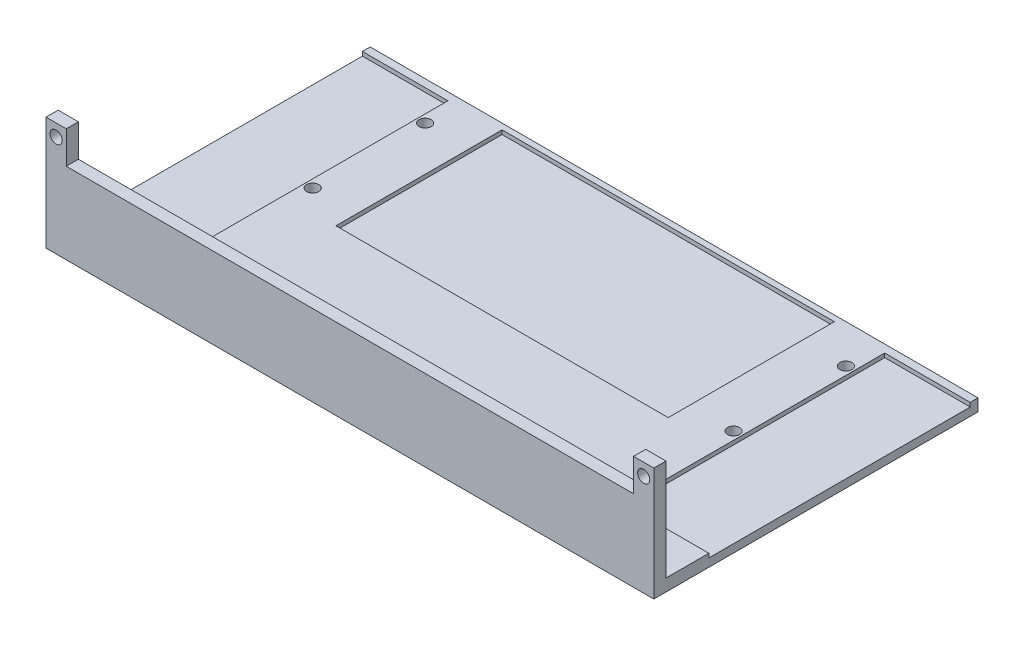
ISO-10303-21;
HEADER;
FILE_DESCRIPTION(('STEP AP214'),'2;1');
FILE_NAME('part.step','',(''),(''),'','','');
FILE_SCHEMA(('AUTOMOTIVE_DESIGN { 1 0 10303 214 1 1 1 1 }'));
ENDSEC;
DATA;
#1=APPLICATION_CONTEXT('core data for automotive mechanical design processes');
#2=APPLICATION_PROTOCOL_DEFINITION('international standard','automotive_design',2000,#1);
#3=PRODUCT_CONTEXT('',#1,'mechanical');
#4=PRODUCT('Part','Part','',(#3));
#5=PRODUCT_RELATED_PRODUCT_CATEGORY('part','',(#4));
#6=PRODUCT_DEFINITION_FORMATION('','',#4);
#7=PRODUCT_DEFINITION_CONTEXT('part definition',#1,'design');
#8=PRODUCT_DEFINITION('design','',#6,#7);
#9=PRODUCT_DEFINITION_SHAPE('','',#8);
#10=(LENGTH_UNIT() NAMED_UNIT(*) SI_UNIT(.MILLI.,.METRE.));
#11=(NAMED_UNIT(*) PLANE_ANGLE_UNIT() SI_UNIT($,.RADIAN.));
#12=(NAMED_UNIT(*) SI_UNIT($,.STERADIAN.) SOLID_ANGLE_UNIT());
#13=UNCERTAINTY_MEASURE_WITH_UNIT(LENGTH_MEASURE(1.E-05),#10,'distance_accuracy_value','');
#14=(GEOMETRIC_REPRESENTATION_CONTEXT(3) GLOBAL_UNCERTAINTY_ASSIGNED_CONTEXT((#13)) GLOBAL_UNIT_ASSIGNED_CONTEXT((#10,
#11,#12)) REPRESENTATION_CONTEXT('',''));
#15=CARTESIAN_POINT('',(0.,0.,0.));
#16=DIRECTION('',(0.,0.,1.));
#17=DIRECTION('',(1.,0.,0.));
#18=AXIS2_PLACEMENT_3D('',#15,#16,#17);
#19=CARTESIAN_POINT('',(-150.,28.,62.755935242314));
#20=DIRECTION('',(0.,-1.,0.));
#21=DIRECTION('',(0.,0.,-1.));
#22=AXIS2_PLACEMENT_3D('',#19,#20,#21);
#23=PLANE('',#22);
#24=DIRECTION('',(1.,0.,0.));
#25=VECTOR('',#24,1.);
#26=CARTESIAN_POINT('',(-150.,28.,59.755935242314));
#27=LINE('',#26,#25);
#28=CARTESIAN_POINT('',(-5.,28.,59.755935242314));
#29=VERTEX_POINT('',#28);
#30=CARTESIAN_POINT('',(0.,28.,59.755935242314));
#31=VERTEX_POINT('',#30);
#32=EDGE_CURVE('E205',#29,#31,#27,.T.);
#33=ORIENTED_EDGE('',*,*,#32,.F.);
#34=DIRECTION('',(0.,0.,1.));
#35=VECTOR('',#34,1.);
#36=CARTESIAN_POINT('',(-5.,28.,59.755935242314));
#37=LINE('',#36,#35);
#38=CARTESIAN_POINT('',(-5.,28.,62.755935242314));
#39=VERTEX_POINT('',#38);
#40=EDGE_CURVE('E190',#29,#39,#37,.T.);
#41=ORIENTED_EDGE('',*,*,#40,.T.);
#42=DIRECTION('',(1.,0.,0.));
#43=VECTOR('',#42,1.);
#44=CARTESIAN_POINT('',(-150.,28.,62.755935242314));
#45=LINE('',#44,#43);
#46=CARTESIAN_POINT('',(0.,28.,62.755935242314));
#47=VERTEX_POINT('',#46);
#48=EDGE_CURVE('E222',#39,#47,#45,.T.);
#49=ORIENTED_EDGE('',*,*,#48,.T.);
#50=DIRECTION('',(0.,0.,-1.));
#51=VECTOR('',#50,1.);
#52=CARTESIAN_POINT('',(0.,28.,62.755935242314));
#53=LINE('',#52,#51);
#54=EDGE_CURVE('E213',#47,#31,#53,.T.);
#55=ORIENTED_EDGE('',*,*,#54,.T.);
#56=EDGE_LOOP('',(#33,#41,#49,#55));
#57=FACE_BOUND('',#56,.T.);
#58=ADVANCED_FACE('F39',(#57),#23,.F.);
#59=CARTESIAN_POINT('',(-150.,0.,-17.244064757686));
#60=DIRECTION('',(0.,0.,-1.));
#61=DIRECTION('',(-1.,0.,0.));
#62=AXIS2_PLACEMENT_3D('',#59,#60,#61);
#63=PLANE('',#62);
#64=DIRECTION('',(0.,1.,0.));
#65=VECTOR('',#64,1.);
#66=CARTESIAN_POINT('',(0.,0.,-17.244064757686));
#67=LINE('',#66,#65);
#68=CARTESIAN_POINT('',(0.,0.,-17.244064757686));
#69=VERTEX_POINT('',#68);
#70=CARTESIAN_POINT('',(0.,3.00000000000001,-17.244064757686));
#71=VERTEX_POINT('',#70);
#72=EDGE_CURVE('E250',#69,#71,#67,.T.);
#73=ORIENTED_EDGE('',*,*,#72,.F.);
#74=DIRECTION('',(1.,0.,0.));
#75=VECTOR('',#74,1.);
#76=CARTESIAN_POINT('',(-150.,0.,-17.244064757686));
#77=LINE('',#76,#75);
#78=CARTESIAN_POINT('',(-150.,0.,-17.244064757686));
#79=VERTEX_POINT('',#78);
#80=EDGE_CURVE('E11',#79,#69,#77,.T.);
#81=ORIENTED_EDGE('',*,*,#80,.F.);
#82=DIRECTION('',(0.,1.,0.));
#83=VECTOR('',#82,1.);
#84=CARTESIAN_POINT('',(-150.,0.,-17.244064757686));
#85=LINE('',#84,#83);
#86=CARTESIAN_POINT('',(-150.,3.00000000000001,-17.244064757686));
#87=VERTEX_POINT('',#86);
#88=EDGE_CURVE('E235',#79,#87,#85,.T.);
#89=ORIENTED_EDGE('',*,*,#88,.T.);
#90=DIRECTION('',(1.,0.,0.));
#91=VECTOR('',#90,1.);
#92=CARTESIAN_POINT('',(-150.,3.00000000000001,-17.244064757686));
#93=LINE('',#92,#91);
#94=EDGE_CURVE('E43',#87,#71,#93,.T.);
#95=ORIENTED_EDGE('',*,*,#94,.T.);
#96=EDGE_LOOP('',(#73,#81,#89,#95));
#97=FACE_BOUND('',#96,.T.);
#98=ADVANCED_FACE('F41',(#97),#63,.T.);
#99=CARTESIAN_POINT('',(-150.,0.,62.755935242314));
#100=DIRECTION('',(0.,-1.,0.));
#101=DIRECTION('',(0.,0.,-1.));
#102=AXIS2_PLACEMENT_3D('',#99,#100,#101);
#103=PLANE('',#102);
#104=CARTESIAN_POINT('',(-23.1,0.,20.005935242314));
#105=DIRECTION('',(0.,1.,0.));
#106=DIRECTION('',(0.,0.,1.));
#107=AXIS2_PLACEMENT_3D('',#104,#105,#106);
#108=CIRCLE('',#107,1.5);
#109=CARTESIAN_POINT('',(-23.1,0.,21.505935242314));
#110=VERTEX_POINT('',#109);
#111=EDGE_CURVE('E438',#110,#110,#108,.T.);
#112=ORIENTED_EDGE('',*,*,#111,.T.);
#113=EDGE_LOOP('',(#112));
#114=FACE_BOUND('',#113,.T.);
#115=CARTESIAN_POINT('',(-23.1,0.,-7.74406475768604));
#116=DIRECTION('',(0.,1.,0.));
#117=DIRECTION('',(0.,0.,1.));
#118=AXIS2_PLACEMENT_3D('',#115,#116,#117);
#119=CIRCLE('',#118,1.5);
#120=CARTESIAN_POINT('',(-23.1,0.,-6.24406475768604));
#121=VERTEX_POINT('',#120);
#122=EDGE_CURVE('E463',#121,#121,#119,.T.);
#123=ORIENTED_EDGE('',*,*,#122,.T.);
#124=EDGE_LOOP('',(#123));
#125=FACE_BOUND('',#124,.T.);
#126=CARTESIAN_POINT('',(-126.934112686196,0.,47.755935242314));
#127=DIRECTION('',(0.,1.,0.));
#128=DIRECTION('',(0.,0.,1.));
#129=AXIS2_PLACEMENT_3D('',#126,#127,#128);
#130=CIRCLE('',#129,1.5);
#131=CARTESIAN_POINT('',(-126.934112686196,0.,49.255935242314));
#132=VERTEX_POINT('',#131);
#133=EDGE_CURVE('E455',#132,#132,#130,.T.);
#134=ORIENTED_EDGE('',*,*,#133,.T.);
#135=EDGE_LOOP('',(#134));
#136=FACE_BOUND('',#135,.T.);
#137=CARTESIAN_POINT('',(-126.934112686196,0.,20.005935242314));
#138=DIRECTION('',(0.,1.,0.));
#139=DIRECTION('',(0.,0.,1.));
#140=AXIS2_PLACEMENT_3D('',#137,#138,#139);
#141=CIRCLE('',#140,1.5);
#142=CARTESIAN_POINT('',(-126.934112686196,0.,21.505935242314));
#143=VERTEX_POINT('',#142);
#144=EDGE_CURVE('E446',#143,#143,#141,.T.);
#145=ORIENTED_EDGE('',*,*,#144,.T.);
#146=EDGE_LOOP('',(#145));
#147=FACE_BOUND('',#146,.T.);
#148=CARTESIAN_POINT('',(-126.934112686196,0.,-7.74406475768604));
#149=DIRECTION('',(0.,1.,0.));
#150=DIRECTION('',(0.,0.,1.));
#151=AXIS2_PLACEMENT_3D('',#148,#149,#150);
#152=CIRCLE('',#151,1.5);
#153=CARTESIAN_POINT('',(-126.934112686196,0.,-6.24406475768604));
#154=VERTEX_POINT('',#153);
#155=EDGE_CURVE('E447',#154,#154,#152,.T.);
#156=ORIENTED_EDGE('',*,*,#155,.T.);
#157=EDGE_LOOP('',(#156));
#158=FACE_BOUND('',#157,.T.);
#159=CARTESIAN_POINT('',(-23.1,0.,47.755935242314));
#160=DIRECTION('',(0.,1.,0.));
#161=DIRECTION('',(0.,0.,1.));
#162=AXIS2_PLACEMENT_3D('',#159,#160,#161);
#163=CIRCLE('',#162,1.5);
#164=CARTESIAN_POINT('',(-23.1,0.,49.255935242314));
#165=VERTEX_POINT('',#164);
#166=EDGE_CURVE('E423',#165,#165,#163,.T.);
#167=ORIENTED_EDGE('',*,*,#166,.T.);
#168=EDGE_LOOP('',(#167));
#169=FACE_BOUND('',#168,.T.);
#170=DIRECTION('',(0.,0.,-1.));
#171=VECTOR('',#170,1.);
#172=CARTESIAN_POINT('',(0.,0.,62.755935242314));
#173=LINE('',#172,#171);
#174=CARTESIAN_POINT('',(0.,0.,62.755935242314));
#175=VERTEX_POINT('',#174);
#176=EDGE_CURVE('E231',#175,#69,#173,.T.);
#177=ORIENTED_EDGE('',*,*,#176,.F.);
#178=DIRECTION('',(1.,0.,0.));
#179=VECTOR('',#178,1.);
#180=CARTESIAN_POINT('',(-150.,0.,62.755935242314));
#181=LINE('',#180,#179);
#182=CARTESIAN_POINT('',(-150.,0.,62.755935242314));
#183=VERTEX_POINT('',#182);
#184=EDGE_CURVE('E49',#183,#175,#181,.T.);
#185=ORIENTED_EDGE('',*,*,#184,.F.);
#186=DIRECTION('',(0.,0.,-1.));
#187=VECTOR('',#186,1.);
#188=CARTESIAN_POINT('',(-150.,0.,62.755935242314));
#189=LINE('',#188,#187);
#190=EDGE_CURVE('E255',#183,#79,#189,.T.);
#191=ORIENTED_EDGE('',*,*,#190,.T.);
#192=ORIENTED_EDGE('',*,*,#80,.T.);
#193=EDGE_LOOP('',(#177,#185,#191,#192));
#194=FACE_BOUND('',#193,.T.);
#195=ADVANCED_FACE('F482',(#114,#125,#136,#147,#158,#169,#194),#103,.T.);
#196=CARTESIAN_POINT('',(-150.,0.,62.755935242314));
#197=DIRECTION('',(0.,0.,-1.));
#198=DIRECTION('',(-1.,0.,0.));
#199=AXIS2_PLACEMENT_3D('',#196,#197,#198);
#200=PLANE('',#199);
#201=CARTESIAN_POINT('',(-2.5,25.,62.755935242314));
#202=DIRECTION('',(0.,0.,1.));
#203=DIRECTION('',(1.,0.,0.));
#204=AXIS2_PLACEMENT_3D('',#201,#202,#203);
#205=CIRCLE('',#204,1.5);
#206=CARTESIAN_POINT('',(-1.,25.,62.755935242314));
#207=VERTEX_POINT('',#206);
#208=EDGE_CURVE('E427',#207,#207,#205,.T.);
#209=ORIENTED_EDGE('',*,*,#208,.F.);
#210=EDGE_LOOP('',(#209));
#211=FACE_BOUND('',#210,.T.);
#212=CARTESIAN_POINT('',(-147.5,25.,62.755935242314));
#213=DIRECTION('',(0.,0.,1.));
#214=DIRECTION('',(1.,0.,0.));
#215=AXIS2_PLACEMENT_3D('',#212,#213,#214);
#216=CIRCLE('',#215,1.5);
#217=CARTESIAN_POINT('',(-146.,25.,62.755935242314));
#218=VERTEX_POINT('',#217);
#219=EDGE_CURVE('E418',#218,#218,#216,.T.);
#220=ORIENTED_EDGE('',*,*,#219,.F.);
#221=EDGE_LOOP('',(#220));
#222=FACE_BOUND('',#221,.T.);
#223=ORIENTED_EDGE('',*,*,#48,.F.);
#224=DIRECTION('',(0.,1.,0.));
#225=VECTOR('',#224,1.);
#226=CARTESIAN_POINT('',(-5.,20.,62.755935242314));
#227=LINE('',#226,#225);
#228=CARTESIAN_POINT('',(-5.,20.,62.755935242314));
#229=VERTEX_POINT('',#228);
#230=EDGE_CURVE('E195',#229,#39,#227,.T.);
#231=ORIENTED_EDGE('',*,*,#230,.F.);
#232=DIRECTION('',(1.,0.,0.));
#233=VECTOR('',#232,1.);
#234=CARTESIAN_POINT('',(-145.,20.,62.755935242314));
#235=LINE('',#234,#233);
#236=CARTESIAN_POINT('',(-145.,20.,62.755935242314));
#237=VERTEX_POINT('',#236);
#238=EDGE_CURVE('E210',#237,#229,#235,.T.);
#239=ORIENTED_EDGE('',*,*,#238,.F.);
#240=DIRECTION('',(0.,-1.,0.));
#241=VECTOR('',#240,1.);
#242=CARTESIAN_POINT('',(-145.,28.,62.755935242314));
#243=LINE('',#242,#241);
#244=CARTESIAN_POINT('',(-145.,28.,62.755935242314));
#245=VERTEX_POINT('',#244);
#246=EDGE_CURVE('E407',#245,#237,#243,.T.);
#247=ORIENTED_EDGE('',*,*,#246,.F.);
#248=CARTESIAN_POINT('',(-150.,28.,62.755935242314));
#249=VERTEX_POINT('',#248);
#250=EDGE_CURVE('E225',#249,#245,#45,.T.);
#251=ORIENTED_EDGE('',*,*,#250,.F.);
#252=DIRECTION('',(0.,1.,0.));
#253=VECTOR('',#252,1.);
#254=CARTESIAN_POINT('',(-150.,0.,62.755935242314));
#255=LINE('',#254,#253);
#256=EDGE_CURVE('E259',#183,#249,#255,.T.);
#257=ORIENTED_EDGE('',*,*,#256,.F.);
#258=ORIENTED_EDGE('',*,*,#184,.T.);
#259=DIRECTION('',(0.,1.,0.));
#260=VECTOR('',#259,1.);
#261=CARTESIAN_POINT('',(0.,0.,62.755935242314));
#262=LINE('',#261,#260);
#263=EDGE_CURVE('E236',#175,#47,#262,.T.);
#264=ORIENTED_EDGE('',*,*,#263,.T.);
#265=EDGE_LOOP('',(#223,#231,#239,#247,#251,#257,#258,#264));
#266=FACE_BOUND('',#265,.T.);
#267=ADVANCED_FACE('F544',(#211,#222,#266),#200,.F.);
#268=ORIENTED_EDGE('',*,*,#250,.T.);
#269=DIRECTION('',(0.,0.,1.));
#270=VECTOR('',#269,1.);
#271=CARTESIAN_POINT('',(-145.,28.,59.755935242314));
#272=LINE('',#271,#270);
#273=CARTESIAN_POINT('',(-145.,28.,59.755935242314));
#274=VERTEX_POINT('',#273);
#275=EDGE_CURVE('E200',#274,#245,#272,.T.);
#276=ORIENTED_EDGE('',*,*,#275,.F.);
#277=CARTESIAN_POINT('',(-150.,28.,59.755935242314));
#278=VERTEX_POINT('',#277);
#279=EDGE_CURVE('E216',#278,#274,#27,.T.);
#280=ORIENTED_EDGE('',*,*,#279,.F.);
#281=DIRECTION('',(0.,0.,-1.));
#282=VECTOR('',#281,1.);
#283=CARTESIAN_POINT('',(-150.,28.,62.755935242314));
#284=LINE('',#283,#282);
#285=EDGE_CURVE('E262',#249,#278,#284,.T.);
#286=ORIENTED_EDGE('',*,*,#285,.F.);
#287=EDGE_LOOP('',(#268,#276,#280,#286));
#288=FACE_BOUND('',#287,.T.);
#289=ADVANCED_FACE('F537',(#288),#23,.F.);
#290=CARTESIAN_POINT('',(-150.,28.,59.755935242314));
#291=DIRECTION('',(0.,0.,1.));
#292=DIRECTION('',(0.,-1.,0.));
#293=AXIS2_PLACEMENT_3D('',#290,#291,#292);
#294=PLANE('',#293);
#295=CARTESIAN_POINT('',(-2.5,25.,59.755935242314));
#296=DIRECTION('',(0.,0.,1.));
#297=DIRECTION('',(1.,0.,0.));
#298=AXIS2_PLACEMENT_3D('',#295,#296,#297);
#299=CIRCLE('',#298,1.5);
#300=CARTESIAN_POINT('',(-1.,25.,59.755935242314));
#301=VERTEX_POINT('',#300);
#302=EDGE_CURVE('E413',#301,#301,#299,.T.);
#303=ORIENTED_EDGE('',*,*,#302,.T.);
#304=EDGE_LOOP('',(#303));
#305=FACE_BOUND('',#304,.T.);
#306=CARTESIAN_POINT('',(-147.5,25.,59.755935242314));
#307=DIRECTION('',(0.,0.,1.));
#308=DIRECTION('',(1.,0.,0.));
#309=AXIS2_PLACEMENT_3D('',#306,#307,#308);
#310=CIRCLE('',#309,1.5);
#311=CARTESIAN_POINT('',(-146.,25.,59.755935242314));
#312=VERTEX_POINT('',#311);
#313=EDGE_CURVE('E422',#312,#312,#310,.T.);
#314=ORIENTED_EDGE('',*,*,#313,.T.);
#315=EDGE_LOOP('',(#314));
#316=FACE_BOUND('',#315,.T.);
#317=DIRECTION('',(1.,0.,0.));
#318=VECTOR('',#317,1.);
#319=CARTESIAN_POINT('',(-145.,20.,59.755935242314));
#320=LINE('',#319,#318);
#321=CARTESIAN_POINT('',(-145.,20.,59.755935242314));
#322=VERTEX_POINT('',#321);
#323=CARTESIAN_POINT('',(-5.,20.,59.755935242314));
#324=VERTEX_POINT('',#323);
#325=EDGE_CURVE('E57',#322,#324,#320,.T.);
#326=ORIENTED_EDGE('',*,*,#325,.T.);
#327=DIRECTION('',(0.,1.,0.));
#328=VECTOR('',#327,1.);
#329=CARTESIAN_POINT('',(-5.,20.,59.755935242314));
#330=LINE('',#329,#328);
#331=EDGE_CURVE('E193',#324,#29,#330,.T.);
#332=ORIENTED_EDGE('',*,*,#331,.T.);
#333=ORIENTED_EDGE('',*,*,#32,.T.);
#334=DIRECTION('',(0.,-1.,0.));
#335=VECTOR('',#334,1.);
#336=CARTESIAN_POINT('',(0.,28.,59.755935242314));
#337=LINE('',#336,#335);
#338=CARTESIAN_POINT('',(0.,3.,59.755935242314));
#339=VERTEX_POINT('',#338);
#340=EDGE_CURVE('E242',#31,#339,#337,.T.);
#341=ORIENTED_EDGE('',*,*,#340,.T.);
#342=DIRECTION('',(1.,0.,0.));
#343=VECTOR('',#342,1.);
#344=CARTESIAN_POINT('',(-150.,3.,59.755935242314));
#345=LINE('',#344,#343);
#346=CARTESIAN_POINT('',(-150.,3.,59.755935242314));
#347=VERTEX_POINT('',#346);
#348=EDGE_CURVE('E217',#347,#339,#345,.T.);
#349=ORIENTED_EDGE('',*,*,#348,.F.);
#350=DIRECTION('',(0.,-1.,0.));
#351=VECTOR('',#350,1.);
#352=CARTESIAN_POINT('',(-150.,28.,59.755935242314));
#353=LINE('',#352,#351);
#354=EDGE_CURVE('E265',#278,#347,#353,.T.);
#355=ORIENTED_EDGE('',*,*,#354,.F.);
#356=ORIENTED_EDGE('',*,*,#279,.T.);
#357=DIRECTION('',(0.,-1.,0.));
#358=VECTOR('',#357,1.);
#359=CARTESIAN_POINT('',(-145.,28.,59.755935242314));
#360=LINE('',#359,#358);
#361=EDGE_CURVE('E209',#274,#322,#360,.T.);
#362=ORIENTED_EDGE('',*,*,#361,.T.);
#363=EDGE_LOOP('',(#326,#332,#333,#341,#349,#355,#356,#362));
#364=FACE_BOUND('',#363,.T.);
#365=ADVANCED_FACE('F203',(#305,#316,#364),#294,.F.);
#366=CARTESIAN_POINT('',(-150.,3.00000000000001,-17.244064757686));
#367=DIRECTION('',(0.,1.,0.));
#368=DIRECTION('',(0.,0.,1.));
#369=AXIS2_PLACEMENT_3D('',#366,#367,#368);
#370=PLANE('',#369);
#371=CARTESIAN_POINT('',(-23.1,3.,20.005935242314));
#372=DIRECTION('',(0.,1.,0.));
#373=DIRECTION('',(0.,0.,1.));
#374=AXIS2_PLACEMENT_3D('',#371,#372,#373);
#375=CIRCLE('',#374,1.5);
#376=CARTESIAN_POINT('',(-23.1,3.,21.505935242314));
#377=VERTEX_POINT('',#376);
#378=EDGE_CURVE('E467',#377,#377,#375,.T.);
#379=ORIENTED_EDGE('',*,*,#378,.F.);
#380=EDGE_LOOP('',(#379));
#381=FACE_BOUND('',#380,.T.);
#382=CARTESIAN_POINT('',(-23.1,3.00000000000001,-7.74406475768604));
#383=DIRECTION('',(0.,1.,0.));
#384=DIRECTION('',(0.,0.,1.));
#385=AXIS2_PLACEMENT_3D('',#382,#383,#384);
#386=CIRCLE('',#385,1.5);
#387=CARTESIAN_POINT('',(-23.1,3.00000000000001,-6.24406475768604));
#388=VERTEX_POINT('',#387);
#389=EDGE_CURVE('E459',#388,#388,#386,.T.);
#390=ORIENTED_EDGE('',*,*,#389,.F.);
#391=EDGE_LOOP('',(#390));
#392=FACE_BOUND('',#391,.T.);
#393=CARTESIAN_POINT('',(-126.934112686196,3.,47.755935242314));
#394=DIRECTION('',(0.,1.,0.));
#395=DIRECTION('',(0.,0.,1.));
#396=AXIS2_PLACEMENT_3D('',#393,#394,#395);
#397=CIRCLE('',#396,1.5);
#398=CARTESIAN_POINT('',(-126.934112686196,3.,49.255935242314));
#399=VERTEX_POINT('',#398);
#400=EDGE_CURVE('E451',#399,#399,#397,.T.);
#401=ORIENTED_EDGE('',*,*,#400,.F.);
#402=EDGE_LOOP('',(#401));
#403=FACE_BOUND('',#402,.T.);
#404=CARTESIAN_POINT('',(-126.934112686196,3.,20.005935242314));
#405=DIRECTION('',(0.,1.,0.));
#406=DIRECTION('',(0.,0.,1.));
#407=AXIS2_PLACEMENT_3D('',#404,#405,#406);
#408=CIRCLE('',#407,1.5);
#409=CARTESIAN_POINT('',(-126.934112686196,3.,21.505935242314));
#410=VERTEX_POINT('',#409);
#411=EDGE_CURVE('E442',#410,#410,#408,.T.);
#412=ORIENTED_EDGE('',*,*,#411,.F.);
#413=EDGE_LOOP('',(#412));
#414=FACE_BOUND('',#413,.T.);
#415=CARTESIAN_POINT('',(-126.934112686196,3.00000000000001,-7.74406475768604));
#416=DIRECTION('',(0.,1.,0.));
#417=DIRECTION('',(0.,0.,1.));
#418=AXIS2_PLACEMENT_3D('',#415,#416,#417);
#419=CIRCLE('',#418,1.5);
#420=CARTESIAN_POINT('',(-126.934112686196,3.00000000000001,-6.24406475768604));
#421=VERTEX_POINT('',#420);
#422=EDGE_CURVE('E474',#421,#421,#419,.T.);
#423=ORIENTED_EDGE('',*,*,#422,.F.);
#424=EDGE_LOOP('',(#423));
#425=FACE_BOUND('',#424,.T.);
#426=CARTESIAN_POINT('',(-23.1,3.,47.755935242314));
#427=DIRECTION('',(0.,1.,0.));
#428=DIRECTION('',(0.,0.,1.));
#429=AXIS2_PLACEMENT_3D('',#426,#427,#428);
#430=CIRCLE('',#429,1.5);
#431=CARTESIAN_POINT('',(-23.1,3.,49.255935242314));
#432=VERTEX_POINT('',#431);
#433=EDGE_CURVE('E434',#432,#432,#430,.T.);
#434=ORIENTED_EDGE('',*,*,#433,.F.);
#435=EDGE_LOOP('',(#434));
#436=FACE_BOUND('',#435,.T.);
#437=DIRECTION('',(1.,0.,0.));
#438=VECTOR('',#437,1.);
#439=CARTESIAN_POINT('',(-34.,3.,25.205935242314));
#440=LINE('',#439,#438);
#441=CARTESIAN_POINT('',(-116.,3.,25.205935242314));
#442=VERTEX_POINT('',#441);
#443=CARTESIAN_POINT('',(-34.,3.,25.205935242314));
#444=VERTEX_POINT('',#443);
#445=EDGE_CURVE('E65',#442,#444,#440,.T.);
#446=ORIENTED_EDGE('',*,*,#445,.F.);
#447=DIRECTION('',(0.,0.,1.));
#448=VECTOR('',#447,1.);
#449=CARTESIAN_POINT('',(-116.,3.,25.205935242314));
#450=LINE('',#449,#448);
#451=CARTESIAN_POINT('',(-116.,3.00000000000001,-15.794064757686));
#452=VERTEX_POINT('',#451);
#453=EDGE_CURVE('E367',#452,#442,#450,.T.);
#454=ORIENTED_EDGE('',*,*,#453,.F.);
#455=DIRECTION('',(-1.,0.,0.));
#456=VECTOR('',#455,1.);
#457=CARTESIAN_POINT('',(-116.,3.00000000000001,-15.794064757686));
#458=LINE('',#457,#456);
#459=CARTESIAN_POINT('',(-34.,3.00000000000001,-15.794064757686));
#460=VERTEX_POINT('',#459);
#461=EDGE_CURVE('E372',#460,#452,#458,.T.);
#462=ORIENTED_EDGE('',*,*,#461,.F.);
#463=DIRECTION('',(0.,0.,-1.));
#464=VECTOR('',#463,1.);
#465=CARTESIAN_POINT('',(-34.,3.00000000000001,-15.794064757686));
#466=LINE('',#465,#464);
#467=EDGE_CURVE('E376',#444,#460,#466,.T.);
#468=ORIENTED_EDGE('',*,*,#467,.F.);
#469=EDGE_LOOP('',(#446,#454,#462,#468));
#470=FACE_BOUND('',#469,.T.);
#471=DIRECTION('',(-1.,0.,0.));
#472=VECTOR('',#471,1.);
#473=CARTESIAN_POINT('',(-128.9,3.00000000000001,-15.3229235967249));
#474=LINE('',#473,#472);
#475=CARTESIAN_POINT('',(-128.9,3.00000000000001,-15.3229235967249));
#476=VERTEX_POINT('',#475);
#477=CARTESIAN_POINT('',(-150.,3.00000000000001,-15.3229235967249));
#478=VERTEX_POINT('',#477);
#479=EDGE_CURVE('E291',#476,#478,#474,.T.);
#480=ORIENTED_EDGE('',*,*,#479,.F.);
#481=DIRECTION('',(0.,0.,-1.));
#482=VECTOR('',#481,1.);
#483=CARTESIAN_POINT('',(-128.9,3.,49.1770764032751));
#484=LINE('',#483,#482);
#485=CARTESIAN_POINT('',(-128.9,3.,49.1770764032751));
#486=VERTEX_POINT('',#485);
#487=EDGE_CURVE('E331',#486,#476,#484,.T.);
#488=ORIENTED_EDGE('',*,*,#487,.F.);
#489=DIRECTION('',(1.,0.,0.));
#490=VECTOR('',#489,1.);
#491=CARTESIAN_POINT('',(-150.,3.,49.1770764032751));
#492=LINE('',#491,#490);
#493=CARTESIAN_POINT('',(-150.,3.,49.1770764032751));
#494=VERTEX_POINT('',#493);
#495=EDGE_CURVE('E336',#494,#486,#492,.T.);
#496=ORIENTED_EDGE('',*,*,#495,.F.);
#497=DIRECTION('',(0.,0.,1.));
#498=VECTOR('',#497,1.);
#499=CARTESIAN_POINT('',(-150.,3.00000000000001,-17.244064757686));
#500=LINE('',#499,#498);
#501=EDGE_CURVE('E273',#494,#347,#500,.T.);
#502=ORIENTED_EDGE('',*,*,#501,.T.);
#503=ORIENTED_EDGE('',*,*,#348,.T.);
#504=DIRECTION('',(0.,0.,1.));
#505=VECTOR('',#504,1.);
#506=CARTESIAN_POINT('',(0.,3.00000000000001,-17.244064757686));
#507=LINE('',#506,#505);
#508=CARTESIAN_POINT('',(0.,3.,49.1770764032751));
#509=VERTEX_POINT('',#508);
#510=EDGE_CURVE('E249',#509,#339,#507,.T.);
#511=ORIENTED_EDGE('',*,*,#510,.F.);
#512=DIRECTION('',(1.,0.,0.));
#513=VECTOR('',#512,1.);
#514=CARTESIAN_POINT('',(-21.1,3.,49.1770764032751));
#515=LINE('',#514,#513);
#516=CARTESIAN_POINT('',(-21.1,3.,49.1770764032751));
#517=VERTEX_POINT('',#516);
#518=EDGE_CURVE('E292',#517,#509,#515,.T.);
#519=ORIENTED_EDGE('',*,*,#518,.F.);
#520=DIRECTION('',(0.,0.,1.));
#521=VECTOR('',#520,1.);
#522=CARTESIAN_POINT('',(-21.1,3.00000000000001,-15.3229235967249));
#523=LINE('',#522,#521);
#524=CARTESIAN_POINT('',(-21.1,3.00000000000001,-15.3229235967249));
#525=VERTEX_POINT('',#524);
#526=EDGE_CURVE('E296',#525,#517,#523,.T.);
#527=ORIENTED_EDGE('',*,*,#526,.F.);
#528=DIRECTION('',(-1.,0.,0.));
#529=VECTOR('',#528,1.);
#530=CARTESIAN_POINT('',(0.,3.00000000000001,-15.3229235967249));
#531=LINE('',#530,#529);
#532=CARTESIAN_POINT('',(0.,3.00000000000001,-15.3229235967249));
#533=VERTEX_POINT('',#532);
#534=EDGE_CURVE('E300',#533,#525,#531,.T.);
#535=ORIENTED_EDGE('',*,*,#534,.F.);
#536=EDGE_CURVE('E245',#71,#533,#507,.T.);
#537=ORIENTED_EDGE('',*,*,#536,.F.);
#538=ORIENTED_EDGE('',*,*,#94,.F.);
#539=EDGE_CURVE('E269',#87,#478,#500,.T.);
#540=ORIENTED_EDGE('',*,*,#539,.T.);
#541=EDGE_LOOP('',(#480,#488,#496,#502,#503,#511,#519,#527,#535,#537,#538,#540));
#542=FACE_BOUND('',#541,.T.);
#543=ADVANCED_FACE('F493',(#381,#392,#403,#414,#425,#436,#470,#542),#370,.T.);
#544=CARTESIAN_POINT('',(-150.,0.,0.));
#545=DIRECTION('',(1.,0.,0.));
#546=DIRECTION('',(0.,0.,-1.));
#547=AXIS2_PLACEMENT_3D('',#544,#545,#546);
#548=PLANE('',#547);
#549=DIRECTION('',(0.,0.,1.));
#550=VECTOR('',#549,1.);
#551=CARTESIAN_POINT('',(-150.,2.00000000000001,-15.3229235967249));
#552=LINE('',#551,#550);
#553=CARTESIAN_POINT('',(-150.,2.00000000000001,-15.3229235967249));
#554=VERTEX_POINT('',#553);
#555=CARTESIAN_POINT('',(-150.,2.,49.1770764032751));
#556=VERTEX_POINT('',#555);
#557=EDGE_CURVE('E349',#554,#556,#552,.T.);
#558=ORIENTED_EDGE('',*,*,#557,.F.);
#559=DIRECTION('',(0.,1.,0.));
#560=VECTOR('',#559,1.);
#561=CARTESIAN_POINT('',(-150.,2.00000000000001,-15.3229235967249));
#562=LINE('',#561,#560);
#563=EDGE_CURVE('E318',#554,#478,#562,.T.);
#564=ORIENTED_EDGE('',*,*,#563,.T.);
#565=ORIENTED_EDGE('',*,*,#539,.F.);
#566=ORIENTED_EDGE('',*,*,#88,.F.);
#567=ORIENTED_EDGE('',*,*,#190,.F.);
#568=ORIENTED_EDGE('',*,*,#256,.T.);
#569=ORIENTED_EDGE('',*,*,#285,.T.);
#570=ORIENTED_EDGE('',*,*,#354,.T.);
#571=ORIENTED_EDGE('',*,*,#501,.F.);
#572=DIRECTION('',(0.,1.,0.));
#573=VECTOR('',#572,1.);
#574=CARTESIAN_POINT('',(-150.,2.,49.1770764032751));
#575=LINE('',#574,#573);
#576=EDGE_CURVE('E322',#556,#494,#575,.T.);
#577=ORIENTED_EDGE('',*,*,#576,.F.);
#578=EDGE_LOOP('',(#558,#564,#565,#566,#567,#568,#569,#570,#571,#577));
#579=FACE_BOUND('',#578,.T.);
#580=ADVANCED_FACE('F496',(#579),#548,.F.);
#581=CARTESIAN_POINT('',(0.,0.,0.));
#582=DIRECTION('',(1.,0.,0.));
#583=DIRECTION('',(0.,0.,-1.));
#584=AXIS2_PLACEMENT_3D('',#581,#582,#583);
#585=PLANE('',#584);
#586=DIRECTION('',(0.,1.,0.));
#587=VECTOR('',#586,1.);
#588=CARTESIAN_POINT('',(0.,2.,49.1770764032751));
#589=LINE('',#588,#587);
#590=CARTESIAN_POINT('',(0.,2.,49.1770764032751));
#591=VERTEX_POINT('',#590);
#592=EDGE_CURVE('E287',#591,#509,#589,.T.);
#593=ORIENTED_EDGE('',*,*,#592,.T.);
#594=ORIENTED_EDGE('',*,*,#510,.T.);
#595=ORIENTED_EDGE('',*,*,#340,.F.);
#596=ORIENTED_EDGE('',*,*,#54,.F.);
#597=ORIENTED_EDGE('',*,*,#263,.F.);
#598=ORIENTED_EDGE('',*,*,#176,.T.);
#599=ORIENTED_EDGE('',*,*,#72,.T.);
#600=ORIENTED_EDGE('',*,*,#536,.T.);
#601=DIRECTION('',(0.,1.,0.));
#602=VECTOR('',#601,1.);
#603=CARTESIAN_POINT('',(0.,2.00000000000001,-15.3229235967249));
#604=LINE('',#603,#602);
#605=CARTESIAN_POINT('',(0.,2.00000000000001,-15.3229235967249));
#606=VERTEX_POINT('',#605);
#607=EDGE_CURVE('E277',#606,#533,#604,.T.);
#608=ORIENTED_EDGE('',*,*,#607,.F.);
#609=DIRECTION('',(0.,0.,-1.));
#610=VECTOR('',#609,1.);
#611=CARTESIAN_POINT('',(0.,2.,49.1770764032751));
#612=LINE('',#611,#610);
#613=EDGE_CURVE('E295',#591,#606,#612,.T.);
#614=ORIENTED_EDGE('',*,*,#613,.F.);
#615=EDGE_LOOP('',(#593,#594,#595,#596,#597,#598,#599,#600,#608,#614));
#616=FACE_BOUND('',#615,.T.);
#617=ADVANCED_FACE('F529',(#616),#585,.T.);
#618=CARTESIAN_POINT('',(-21.1,2.,49.1770764032751));
#619=DIRECTION('',(0.,0.,1.));
#620=DIRECTION('',(1.,0.,0.));
#621=AXIS2_PLACEMENT_3D('',#618,#619,#620);
#622=PLANE('',#621);
#623=ORIENTED_EDGE('',*,*,#518,.T.);
#624=ORIENTED_EDGE('',*,*,#592,.F.);
#625=DIRECTION('',(1.,0.,0.));
#626=VECTOR('',#625,1.);
#627=CARTESIAN_POINT('',(-21.1,2.,49.1770764032751));
#628=LINE('',#627,#626);
#629=CARTESIAN_POINT('',(-21.1,2.,49.1770764032751));
#630=VERTEX_POINT('',#629);
#631=EDGE_CURVE('E281',#630,#591,#628,.T.);
#632=ORIENTED_EDGE('',*,*,#631,.F.);
#633=DIRECTION('',(0.,1.,0.));
#634=VECTOR('',#633,1.);
#635=CARTESIAN_POINT('',(-21.1,2.,49.1770764032751));
#636=LINE('',#635,#634);
#637=EDGE_CURVE('E284',#630,#517,#636,.T.);
#638=ORIENTED_EDGE('',*,*,#637,.T.);
#639=EDGE_LOOP('',(#623,#624,#632,#638));
#640=FACE_BOUND('',#639,.T.);
#641=ADVANCED_FACE('F583',(#640),#622,.F.);
#642=CARTESIAN_POINT('',(-21.1,2.00000000000001,-15.3229235967249));
#643=DIRECTION('',(-1.,0.,0.));
#644=DIRECTION('',(0.,0.,1.));
#645=AXIS2_PLACEMENT_3D('',#642,#643,#644);
#646=PLANE('',#645);
#647=ORIENTED_EDGE('',*,*,#526,.T.);
#648=ORIENTED_EDGE('',*,*,#637,.F.);
#649=DIRECTION('',(0.,0.,1.));
#650=VECTOR('',#649,1.);
#651=CARTESIAN_POINT('',(-21.1,2.00000000000001,-15.3229235967249));
#652=LINE('',#651,#650);
#653=CARTESIAN_POINT('',(-21.1,2.00000000000001,-15.3229235967249));
#654=VERTEX_POINT('',#653);
#655=EDGE_CURVE('E307',#654,#630,#652,.T.);
#656=ORIENTED_EDGE('',*,*,#655,.F.);
#657=DIRECTION('',(0.,1.,0.));
#658=VECTOR('',#657,1.);
#659=CARTESIAN_POINT('',(-21.1,2.00000000000001,-15.3229235967249));
#660=LINE('',#659,#658);
#661=EDGE_CURVE('E280',#654,#525,#660,.T.);
#662=ORIENTED_EDGE('',*,*,#661,.T.);
#663=EDGE_LOOP('',(#647,#648,#656,#662));
#664=FACE_BOUND('',#663,.T.);
#665=ADVANCED_FACE('F590',(#664),#646,.F.);
#666=CARTESIAN_POINT('',(0.,2.00000000000001,-15.3229235967249));
#667=DIRECTION('',(0.,0.,-1.));
#668=DIRECTION('',(-1.,0.,0.));
#669=AXIS2_PLACEMENT_3D('',#666,#667,#668);
#670=PLANE('',#669);
#671=ORIENTED_EDGE('',*,*,#534,.T.);
#672=ORIENTED_EDGE('',*,*,#661,.F.);
#673=DIRECTION('',(-1.,0.,0.));
#674=VECTOR('',#673,1.);
#675=CARTESIAN_POINT('',(0.,2.00000000000001,-15.3229235967249));
#676=LINE('',#675,#674);
#677=EDGE_CURVE('E311',#606,#654,#676,.T.);
#678=ORIENTED_EDGE('',*,*,#677,.F.);
#679=ORIENTED_EDGE('',*,*,#607,.T.);
#680=EDGE_LOOP('',(#671,#672,#678,#679));
#681=FACE_BOUND('',#680,.T.);
#682=ADVANCED_FACE('F586',(#681),#670,.F.);
#683=CARTESIAN_POINT('',(0.,2.00000000000001,0.));
#684=DIRECTION('',(0.,1.,0.));
#685=DIRECTION('',(0.,0.,1.));
#686=AXIS2_PLACEMENT_3D('',#683,#684,#685);
#687=PLANE('',#686);
#688=ORIENTED_EDGE('',*,*,#613,.T.);
#689=ORIENTED_EDGE('',*,*,#677,.T.);
#690=ORIENTED_EDGE('',*,*,#655,.T.);
#691=ORIENTED_EDGE('',*,*,#631,.T.);
#692=EDGE_LOOP('',(#688,#689,#690,#691));
#693=FACE_BOUND('',#692,.T.);
#694=ADVANCED_FACE('F589',(#693),#687,.T.);
#695=CARTESIAN_POINT('',(-128.9,2.00000000000001,-15.3229235967249));
#696=DIRECTION('',(0.,0.,-1.));
#697=DIRECTION('',(-1.,0.,0.));
#698=AXIS2_PLACEMENT_3D('',#695,#696,#697);
#699=PLANE('',#698);
#700=ORIENTED_EDGE('',*,*,#479,.T.);
#701=ORIENTED_EDGE('',*,*,#563,.F.);
#702=DIRECTION('',(-1.,0.,0.));
#703=VECTOR('',#702,1.);
#704=CARTESIAN_POINT('',(-128.9,2.00000000000001,-15.3229235967249));
#705=LINE('',#704,#703);
#706=CARTESIAN_POINT('',(-128.9,2.00000000000001,-15.3229235967249));
#707=VERTEX_POINT('',#706);
#708=EDGE_CURVE('E335',#707,#554,#705,.T.);
#709=ORIENTED_EDGE('',*,*,#708,.F.);
#710=DIRECTION('',(0.,1.,0.));
#711=VECTOR('',#710,1.);
#712=CARTESIAN_POINT('',(-128.9,2.00000000000001,-15.3229235967249));
#713=LINE('',#712,#711);
#714=EDGE_CURVE('E254',#707,#476,#713,.T.);
#715=ORIENTED_EDGE('',*,*,#714,.T.);
#716=EDGE_LOOP('',(#700,#701,#709,#715));
#717=FACE_BOUND('',#716,.T.);
#718=ADVANCED_FACE('F509',(#717),#699,.F.);
#719=CARTESIAN_POINT('',(-128.9,2.,49.1770764032751));
#720=DIRECTION('',(1.,0.,0.));
#721=DIRECTION('',(0.,0.,-1.));
#722=AXIS2_PLACEMENT_3D('',#719,#720,#721);
#723=PLANE('',#722);
#724=ORIENTED_EDGE('',*,*,#487,.T.);
#725=ORIENTED_EDGE('',*,*,#714,.F.);
#726=DIRECTION('',(0.,0.,-1.));
#727=VECTOR('',#726,1.);
#728=CARTESIAN_POINT('',(-128.9,2.,49.1770764032751));
#729=LINE('',#728,#727);
#730=CARTESIAN_POINT('',(-128.9,2.,49.1770764032751));
#731=VERTEX_POINT('',#730);
#732=EDGE_CURVE('E323',#731,#707,#729,.T.);
#733=ORIENTED_EDGE('',*,*,#732,.F.);
#734=DIRECTION('',(0.,1.,0.));
#735=VECTOR('',#734,1.);
#736=CARTESIAN_POINT('',(-128.9,2.,49.1770764032751));
#737=LINE('',#736,#735);
#738=EDGE_CURVE('E326',#731,#486,#737,.T.);
#739=ORIENTED_EDGE('',*,*,#738,.T.);
#740=EDGE_LOOP('',(#724,#725,#733,#739));
#741=FACE_BOUND('',#740,.T.);
#742=ADVANCED_FACE('F520',(#741),#723,.F.);
#743=CARTESIAN_POINT('',(-150.,2.,49.1770764032751));
#744=DIRECTION('',(0.,0.,1.));
#745=DIRECTION('',(0.,-1.,0.));
#746=AXIS2_PLACEMENT_3D('',#743,#744,#745);
#747=PLANE('',#746);
#748=ORIENTED_EDGE('',*,*,#495,.T.);
#749=ORIENTED_EDGE('',*,*,#738,.F.);
#750=DIRECTION('',(1.,0.,0.));
#751=VECTOR('',#750,1.);
#752=CARTESIAN_POINT('',(-150.,2.,49.1770764032751));
#753=LINE('',#752,#751);
#754=EDGE_CURVE('E345',#556,#731,#753,.T.);
#755=ORIENTED_EDGE('',*,*,#754,.F.);
#756=ORIENTED_EDGE('',*,*,#576,.T.);
#757=EDGE_LOOP('',(#748,#749,#755,#756));
#758=FACE_BOUND('',#757,.T.);
#759=ADVANCED_FACE('F522',(#758),#747,.F.);
#760=CARTESIAN_POINT('',(0.,2.00000000000001,0.));
#761=DIRECTION('',(0.,1.,0.));
#762=DIRECTION('',(0.,0.,1.));
#763=AXIS2_PLACEMENT_3D('',#760,#761,#762);
#764=PLANE('',#763);
#765=ORIENTED_EDGE('',*,*,#708,.T.);
#766=ORIENTED_EDGE('',*,*,#557,.T.);
#767=ORIENTED_EDGE('',*,*,#754,.T.);
#768=ORIENTED_EDGE('',*,*,#732,.T.);
#769=EDGE_LOOP('',(#765,#766,#767,#768));
#770=FACE_BOUND('',#769,.T.);
#771=ADVANCED_FACE('F517',(#770),#764,.T.);
#772=CARTESIAN_POINT('',(-34.,2.,25.205935242314));
#773=DIRECTION('',(0.,0.,1.));
#774=DIRECTION('',(1.,0.,0.));
#775=AXIS2_PLACEMENT_3D('',#772,#773,#774);
#776=PLANE('',#775);
#777=ORIENTED_EDGE('',*,*,#445,.T.);
#778=DIRECTION('',(0.,1.,0.));
#779=VECTOR('',#778,1.);
#780=CARTESIAN_POINT('',(-34.,2.,25.205935242314));
#781=LINE('',#780,#779);
#782=CARTESIAN_POINT('',(-34.,2.,25.205935242314));
#783=VERTEX_POINT('',#782);
#784=EDGE_CURVE('E355',#783,#444,#781,.T.);
#785=ORIENTED_EDGE('',*,*,#784,.F.);
#786=DIRECTION('',(1.,0.,0.));
#787=VECTOR('',#786,1.);
#788=CARTESIAN_POINT('',(-34.,2.,25.205935242314));
#789=LINE('',#788,#787);
#790=CARTESIAN_POINT('',(-116.,2.,25.205935242314));
#791=VERTEX_POINT('',#790);
#792=EDGE_CURVE('E371',#791,#783,#789,.T.);
#793=ORIENTED_EDGE('',*,*,#792,.F.);
#794=DIRECTION('',(0.,1.,0.));
#795=VECTOR('',#794,1.);
#796=CARTESIAN_POINT('',(-116.,2.,25.205935242314));
#797=LINE('',#796,#795);
#798=EDGE_CURVE('E304',#791,#442,#797,.T.);
#799=ORIENTED_EDGE('',*,*,#798,.T.);
#800=EDGE_LOOP('',(#777,#785,#793,#799));
#801=FACE_BOUND('',#800,.T.);
#802=ADVANCED_FACE('F609',(#801),#776,.F.);
#803=CARTESIAN_POINT('',(-116.,2.,25.205935242314));
#804=DIRECTION('',(-1.,0.,0.));
#805=DIRECTION('',(0.,0.,1.));
#806=AXIS2_PLACEMENT_3D('',#803,#804,#805);
#807=PLANE('',#806);
#808=ORIENTED_EDGE('',*,*,#453,.T.);
#809=ORIENTED_EDGE('',*,*,#798,.F.);
#810=DIRECTION('',(0.,0.,1.));
#811=VECTOR('',#810,1.);
#812=CARTESIAN_POINT('',(-116.,2.,25.205935242314));
#813=LINE('',#812,#811);
#814=CARTESIAN_POINT('',(-116.,2.00000000000001,-15.794064757686));
#815=VERTEX_POINT('',#814);
#816=EDGE_CURVE('E359',#815,#791,#813,.T.);
#817=ORIENTED_EDGE('',*,*,#816,.F.);
#818=DIRECTION('',(0.,1.,0.));
#819=VECTOR('',#818,1.);
#820=CARTESIAN_POINT('',(-116.,2.00000000000001,-15.794064757686));
#821=LINE('',#820,#819);
#822=EDGE_CURVE('E362',#815,#452,#821,.T.);
#823=ORIENTED_EDGE('',*,*,#822,.T.);
#824=EDGE_LOOP('',(#808,#809,#817,#823));
#825=FACE_BOUND('',#824,.T.);
#826=ADVANCED_FACE('F612',(#825),#807,.F.);
#827=CARTESIAN_POINT('',(-116.,2.00000000000001,-15.794064757686));
#828=DIRECTION('',(0.,0.,-1.));
#829=DIRECTION('',(0.,1.,0.));
#830=AXIS2_PLACEMENT_3D('',#827,#828,#829);
#831=PLANE('',#830);
#832=ORIENTED_EDGE('',*,*,#461,.T.);
#833=ORIENTED_EDGE('',*,*,#822,.F.);
#834=DIRECTION('',(-1.,0.,0.));
#835=VECTOR('',#834,1.);
#836=CARTESIAN_POINT('',(-116.,2.00000000000001,-15.794064757686));
#837=LINE('',#836,#835);
#838=CARTESIAN_POINT('',(-34.,2.00000000000001,-15.794064757686));
#839=VERTEX_POINT('',#838);
#840=EDGE_CURVE('E386',#839,#815,#837,.T.);
#841=ORIENTED_EDGE('',*,*,#840,.F.);
#842=DIRECTION('',(0.,1.,0.));
#843=VECTOR('',#842,1.);
#844=CARTESIAN_POINT('',(-34.,2.00000000000001,-15.794064757686));
#845=LINE('',#844,#843);
#846=EDGE_CURVE('E358',#839,#460,#845,.T.);
#847=ORIENTED_EDGE('',*,*,#846,.T.);
#848=EDGE_LOOP('',(#832,#833,#841,#847));
#849=FACE_BOUND('',#848,.T.);
#850=ADVANCED_FACE('F616',(#849),#831,.F.);
#851=CARTESIAN_POINT('',(-34.,2.00000000000001,-15.794064757686));
#852=DIRECTION('',(1.,0.,0.));
#853=DIRECTION('',(0.,0.,-1.));
#854=AXIS2_PLACEMENT_3D('',#851,#852,#853);
#855=PLANE('',#854);
#856=ORIENTED_EDGE('',*,*,#467,.T.);
#857=ORIENTED_EDGE('',*,*,#846,.F.);
#858=DIRECTION('',(0.,0.,-1.));
#859=VECTOR('',#858,1.);
#860=CARTESIAN_POINT('',(-34.,2.00000000000001,-15.794064757686));
#861=LINE('',#860,#859);
#862=EDGE_CURVE('E390',#783,#839,#861,.T.);
#863=ORIENTED_EDGE('',*,*,#862,.F.);
#864=ORIENTED_EDGE('',*,*,#784,.T.);
#865=EDGE_LOOP('',(#856,#857,#863,#864));
#866=FACE_BOUND('',#865,.T.);
#867=ADVANCED_FACE('F613',(#866),#855,.F.);
#868=CARTESIAN_POINT('',(0.,2.00000000000001,0.));
#869=DIRECTION('',(0.,-1.,0.));
#870=DIRECTION('',(0.,0.,-1.));
#871=AXIS2_PLACEMENT_3D('',#868,#869,#870);
#872=PLANE('',#871);
#873=ORIENTED_EDGE('',*,*,#792,.T.);
#874=ORIENTED_EDGE('',*,*,#862,.T.);
#875=ORIENTED_EDGE('',*,*,#840,.T.);
#876=ORIENTED_EDGE('',*,*,#816,.T.);
#877=EDGE_LOOP('',(#873,#874,#875,#876));
#878=FACE_BOUND('',#877,.T.);
#879=ADVANCED_FACE('F555',(#878),#872,.F.);
#880=CARTESIAN_POINT('',(-5.,20.,59.755935242314));
#881=DIRECTION('',(1.,0.,0.));
#882=DIRECTION('',(0.,1.,0.));
#883=AXIS2_PLACEMENT_3D('',#880,#881,#882);
#884=PLANE('',#883);
#885=ORIENTED_EDGE('',*,*,#230,.T.);
#886=ORIENTED_EDGE('',*,*,#40,.F.);
#887=ORIENTED_EDGE('',*,*,#331,.F.);
#888=DIRECTION('',(0.,0.,1.));
#889=VECTOR('',#888,1.);
#890=CARTESIAN_POINT('',(-5.,20.,59.755935242314));
#891=LINE('',#890,#889);
#892=EDGE_CURVE('E382',#324,#229,#891,.T.);
#893=ORIENTED_EDGE('',*,*,#892,.T.);
#894=EDGE_LOOP('',(#885,#886,#887,#893));
#895=FACE_BOUND('',#894,.T.);
#896=ADVANCED_FACE('F192',(#895),#884,.F.);
#897=CARTESIAN_POINT('',(-145.,20.,59.755935242314));
#898=DIRECTION('',(0.,-1.,0.));
#899=DIRECTION('',(0.,0.,-1.));
#900=AXIS2_PLACEMENT_3D('',#897,#898,#899);
#901=PLANE('',#900);
#902=ORIENTED_EDGE('',*,*,#238,.T.);
#903=ORIENTED_EDGE('',*,*,#892,.F.);
#904=ORIENTED_EDGE('',*,*,#325,.F.);
#905=DIRECTION('',(0.,0.,1.));
#906=VECTOR('',#905,1.);
#907=CARTESIAN_POINT('',(-145.,20.,59.755935242314));
#908=LINE('',#907,#906);
#909=EDGE_CURVE('E399',#322,#237,#908,.T.);
#910=ORIENTED_EDGE('',*,*,#909,.T.);
#911=EDGE_LOOP('',(#902,#903,#904,#910));
#912=FACE_BOUND('',#911,.T.);
#913=ADVANCED_FACE('F546',(#912),#901,.F.);
#914=CARTESIAN_POINT('',(-145.,28.,59.755935242314));
#915=DIRECTION('',(-1.,0.,0.));
#916=DIRECTION('',(0.,0.,1.));
#917=AXIS2_PLACEMENT_3D('',#914,#915,#916);
#918=PLANE('',#917);
#919=ORIENTED_EDGE('',*,*,#246,.T.);
#920=ORIENTED_EDGE('',*,*,#909,.F.);
#921=ORIENTED_EDGE('',*,*,#361,.F.);
#922=ORIENTED_EDGE('',*,*,#275,.T.);
#923=EDGE_LOOP('',(#919,#920,#921,#922));
#924=FACE_BOUND('',#923,.T.);
#925=ADVANCED_FACE('F541',(#924),#918,.F.);
#926=CARTESIAN_POINT('',(-147.5,25.,59.755935242314));
#927=DIRECTION('',(0.,0.,1.));
#928=DIRECTION('',(1.,0.,0.));
#929=AXIS2_PLACEMENT_3D('',#926,#927,#928);
#930=CYLINDRICAL_SURFACE('',#929,1.5);
#931=ORIENTED_EDGE('',*,*,#313,.F.);
#932=EDGE_LOOP('',(#931));
#933=FACE_BOUND('',#932,.T.);
#934=ORIENTED_EDGE('',*,*,#219,.T.);
#935=EDGE_LOOP('',(#934));
#936=FACE_BOUND('',#935,.T.);
#937=ADVANCED_FACE('F553',(#933,#936),#930,.F.);
#938=CARTESIAN_POINT('',(-2.5,25.,59.755935242314));
#939=DIRECTION('',(0.,0.,1.));
#940=DIRECTION('',(1.,0.,0.));
#941=AXIS2_PLACEMENT_3D('',#938,#939,#940);
#942=CYLINDRICAL_SURFACE('',#941,1.5);
#943=ORIENTED_EDGE('',*,*,#302,.F.);
#944=EDGE_LOOP('',(#943));
#945=FACE_BOUND('',#944,.T.);
#946=ORIENTED_EDGE('',*,*,#208,.T.);
#947=EDGE_LOOP('',(#946));
#948=FACE_BOUND('',#947,.T.);
#949=ADVANCED_FACE('F673',(#945,#948),#942,.F.);
#950=CARTESIAN_POINT('',(-23.1,0.,47.755935242314));
#951=DIRECTION('',(0.,1.,0.));
#952=DIRECTION('',(0.,0.,1.));
#953=AXIS2_PLACEMENT_3D('',#950,#951,#952);
#954=CYLINDRICAL_SURFACE('',#953,1.5);
#955=ORIENTED_EDGE('',*,*,#166,.F.);
#956=EDGE_LOOP('',(#955));
#957=FACE_BOUND('',#956,.T.);
#958=ORIENTED_EDGE('',*,*,#433,.T.);
#959=EDGE_LOOP('',(#958));
#960=FACE_BOUND('',#959,.T.);
#961=ADVANCED_FACE('F489',(#957,#960),#954,.F.);
#962=CARTESIAN_POINT('',(-126.934112686196,0.,-7.74406475768604));
#963=DIRECTION('',(0.,1.,0.));
#964=DIRECTION('',(0.,0.,1.));
#965=AXIS2_PLACEMENT_3D('',#962,#963,#964);
#966=CYLINDRICAL_SURFACE('',#965,1.5);
#967=ORIENTED_EDGE('',*,*,#155,.F.);
#968=EDGE_LOOP('',(#967));
#969=FACE_BOUND('',#968,.T.);
#970=ORIENTED_EDGE('',*,*,#422,.T.);
#971=EDGE_LOOP('',(#970));
#972=FACE_BOUND('',#971,.T.);
#973=ADVANCED_FACE('F485',(#969,#972),#966,.F.);
#974=CARTESIAN_POINT('',(-126.934112686196,0.,20.005935242314));
#975=DIRECTION('',(0.,1.,0.));
#976=DIRECTION('',(0.,0.,1.));
#977=AXIS2_PLACEMENT_3D('',#974,#975,#976);
#978=CYLINDRICAL_SURFACE('',#977,1.5);
#979=ORIENTED_EDGE('',*,*,#144,.F.);
#980=EDGE_LOOP('',(#979));
#981=FACE_BOUND('',#980,.T.);
#982=ORIENTED_EDGE('',*,*,#411,.T.);
#983=EDGE_LOOP('',(#982));
#984=FACE_BOUND('',#983,.T.);
#985=ADVANCED_FACE('F488',(#981,#984),#978,.F.);
#986=CARTESIAN_POINT('',(-126.934112686196,0.,47.755935242314));
#987=DIRECTION('',(0.,1.,0.));
#988=DIRECTION('',(0.,0.,1.));
#989=AXIS2_PLACEMENT_3D('',#986,#987,#988);
#990=CYLINDRICAL_SURFACE('',#989,1.5);
#991=ORIENTED_EDGE('',*,*,#133,.F.);
#992=EDGE_LOOP('',(#991));
#993=FACE_BOUND('',#992,.T.);
#994=ORIENTED_EDGE('',*,*,#400,.T.);
#995=EDGE_LOOP('',(#994));
#996=FACE_BOUND('',#995,.T.);
#997=ADVANCED_FACE('F718',(#993,#996),#990,.F.);
#998=CARTESIAN_POINT('',(-23.1,0.,-7.74406475768604));
#999=DIRECTION('',(0.,1.,0.));
#1000=DIRECTION('',(0.,0.,1.));
#1001=AXIS2_PLACEMENT_3D('',#998,#999,#1000);
#1002=CYLINDRICAL_SURFACE('',#1001,1.5);
#1003=ORIENTED_EDGE('',*,*,#122,.F.);
#1004=EDGE_LOOP('',(#1003));
#1005=FACE_BOUND('',#1004,.T.);
#1006=ORIENTED_EDGE('',*,*,#389,.T.);
#1007=EDGE_LOOP('',(#1006));
#1008=FACE_BOUND('',#1007,.T.);
#1009=ADVANCED_FACE('F728',(#1005,#1008),#1002,.F.);
#1010=CARTESIAN_POINT('',(-23.1,0.,20.005935242314));
#1011=DIRECTION('',(0.,1.,0.));
#1012=DIRECTION('',(0.,0.,1.));
#1013=AXIS2_PLACEMENT_3D('',#1010,#1011,#1012);
#1014=CYLINDRICAL_SURFACE('',#1013,1.5);
#1015=ORIENTED_EDGE('',*,*,#111,.F.);
#1016=EDGE_LOOP('',(#1015));
#1017=FACE_BOUND('',#1016,.T.);
#1018=ORIENTED_EDGE('',*,*,#378,.T.);
#1019=EDGE_LOOP('',(#1018));
#1020=FACE_BOUND('',#1019,.T.);
#1021=ADVANCED_FACE('F738',(#1017,#1020),#1014,.F.);
#1022=CLOSED_SHELL('',(#58,#98,#195,#267,#289,#365,#543,#580,#617,#641,#665,#682,#694,#718,#742,
#759,#771,#802,#826,#850,#867,#879,#896,#913,#925,#937,#949,#961,#973,#985,#997,#1009,#1021));
#1023=MANIFOLD_SOLID_BREP('B2',#1022);
#1024=ADVANCED_BREP_SHAPE_REPRESENTATION('',(#18,#1023),#14);
#1025=SHAPE_DEFINITION_REPRESENTATION(#9,#1024);
ENDSEC;
END-ISO-10303-21;
